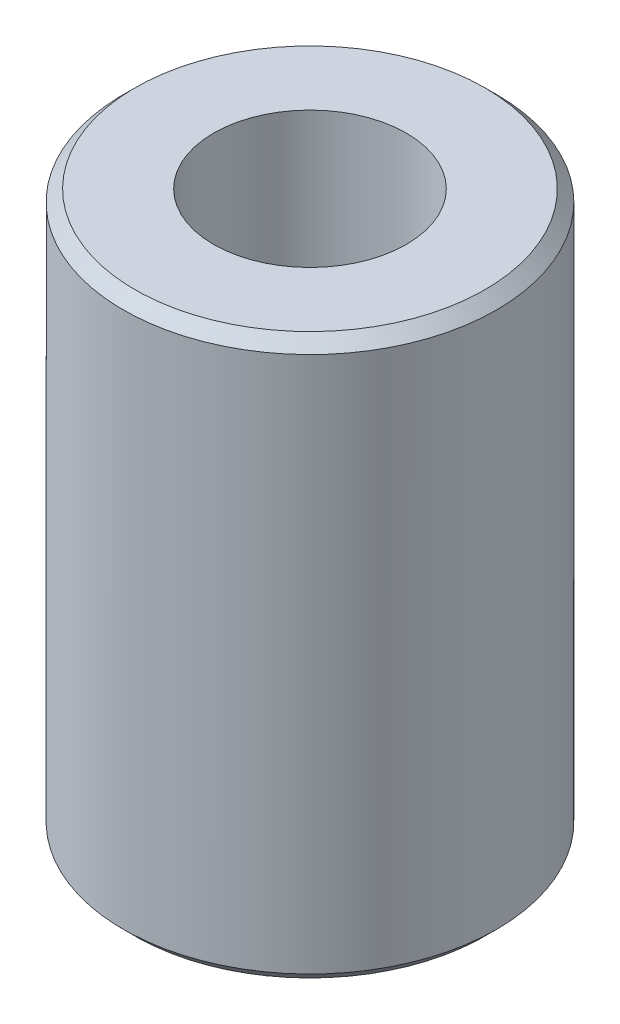
ISO-10303-21;
HEADER;
FILE_DESCRIPTION(('STEP AP214'),'2;1');
FILE_NAME('part.step','',(''),(''),'','','');
FILE_SCHEMA(('AUTOMOTIVE_DESIGN { 1 0 10303 214 1 1 1 1 }'));
ENDSEC;
DATA;
#1=APPLICATION_CONTEXT('core data for automotive mechanical design processes');
#2=APPLICATION_PROTOCOL_DEFINITION('international standard','automotive_design',2000,#1);
#3=PRODUCT_CONTEXT('',#1,'mechanical');
#4=PRODUCT('Part','Part','',(#3));
#5=PRODUCT_RELATED_PRODUCT_CATEGORY('part','',(#4));
#6=PRODUCT_DEFINITION_FORMATION('','',#4);
#7=PRODUCT_DEFINITION_CONTEXT('part definition',#1,'design');
#8=PRODUCT_DEFINITION('design','',#6,#7);
#9=PRODUCT_DEFINITION_SHAPE('','',#8);
#10=(LENGTH_UNIT() NAMED_UNIT(*) SI_UNIT(.MILLI.,.METRE.));
#11=(NAMED_UNIT(*) PLANE_ANGLE_UNIT() SI_UNIT($,.RADIAN.));
#12=(NAMED_UNIT(*) SI_UNIT($,.STERADIAN.) SOLID_ANGLE_UNIT());
#13=UNCERTAINTY_MEASURE_WITH_UNIT(LENGTH_MEASURE(1.E-05),#10,'distance_accuracy_value','');
#14=(GEOMETRIC_REPRESENTATION_CONTEXT(3) GLOBAL_UNCERTAINTY_ASSIGNED_CONTEXT((#13)) GLOBAL_UNIT_ASSIGNED_CONTEXT((#10,
#11,#12)) REPRESENTATION_CONTEXT('',''));
#15=CARTESIAN_POINT('',(0.,0.,0.));
#16=DIRECTION('',(0.,0.,1.));
#17=DIRECTION('',(1.,0.,0.));
#18=AXIS2_PLACEMENT_3D('',#15,#16,#17);
#19=CARTESIAN_POINT('',(0.,5.00000000118916,0.));
#20=DIRECTION('',(0.,1.,0.));
#21=DIRECTION('',(0.,0.,1.));
#22=AXIS2_PLACEMENT_3D('',#19,#20,#21);
#23=CONICAL_SURFACE('',#22,2.06699999921511,1.02974425747389);
#24=CARTESIAN_POINT('',(0.,3.75802109874712,0.));
#25=VERTEX_POINT('',#24);
#26=VERTEX_LOOP('',#25);
#27=FACE_BOUND('',#26,.T.);
#28=CARTESIAN_POINT('',(0.,5.,0.));
#29=DIRECTION('',(0.,1.,0.));
#30=DIRECTION('',(-1.,0.,0.));
#31=AXIS2_PLACEMENT_3D('',#28,#29,#30);
#32=CIRCLE('',#31,2.067);
#33=CARTESIAN_POINT('',(-2.067,5.,0.));
#34=VERTEX_POINT('',#33);
#35=EDGE_CURVE('E33',#34,#34,#32,.T.);
#36=ORIENTED_EDGE('',*,*,#35,.T.);
#37=EDGE_LOOP('',(#36));
#38=FACE_BOUND('',#37,.T.);
#39=ADVANCED_FACE('F17',(#27,#38),#23,.F.);
#40=CARTESIAN_POINT('',(0.,8.5,0.));
#41=DIRECTION('',(0.,1.,0.));
#42=DIRECTION('',(-1.,0.,0.));
#43=AXIS2_PLACEMENT_3D('',#40,#41,#42);
#44=CYLINDRICAL_SURFACE('',#43,2.067);
#45=ORIENTED_EDGE('',*,*,#35,.F.);
#46=EDGE_LOOP('',(#45));
#47=FACE_BOUND('',#46,.T.);
#48=CARTESIAN_POINT('',(0.,12.,0.));
#49=DIRECTION('',(0.,1.,0.));
#50=DIRECTION('',(-1.,0.,0.));
#51=AXIS2_PLACEMENT_3D('',#48,#49,#50);
#52=CIRCLE('',#51,2.067);
#53=CARTESIAN_POINT('',(-2.067,12.,0.));
#54=VERTEX_POINT('',#53);
#55=EDGE_CURVE('E20',#54,#54,#52,.F.);
#56=ORIENTED_EDGE('',*,*,#55,.F.);
#57=EDGE_LOOP('',(#56));
#58=FACE_BOUND('',#57,.T.);
#59=ADVANCED_FACE('F30',(#47,#58),#44,.F.);
#60=CARTESIAN_POINT('',(2.,0.,0.));
#61=DIRECTION('',(0.,-1.,0.));
#62=DIRECTION('',(0.,0.,-1.));
#63=AXIS2_PLACEMENT_3D('',#60,#61,#62);
#64=PLANE('',#63);
#65=CARTESIAN_POINT('',(0.,-1.13686946141833E-10,0.));
#66=DIRECTION('',(0.,1.,0.));
#67=DIRECTION('',(-1.,0.,0.));
#68=AXIS2_PLACEMENT_3D('',#65,#66,#67);
#69=CIRCLE('',#68,3.75000000008185);
#70=CARTESIAN_POINT('',(-3.75000000008185,-1.13686793675903E-10,0.));
#71=VERTEX_POINT('',#70);
#72=EDGE_CURVE('E37',#71,#71,#69,.T.);
#73=ORIENTED_EDGE('',*,*,#72,.F.);
#74=EDGE_LOOP('',(#73));
#75=FACE_BOUND('',#74,.T.);
#76=ADVANCED_FACE('F52',(#75),#64,.T.);
#77=CARTESIAN_POINT('',(2.,12.,0.));
#78=DIRECTION('',(0.,1.,0.));
#79=DIRECTION('',(0.,0.,1.));
#80=AXIS2_PLACEMENT_3D('',#77,#78,#79);
#81=PLANE('',#80);
#82=ORIENTED_EDGE('',*,*,#55,.T.);
#83=EDGE_LOOP('',(#82));
#84=FACE_BOUND('',#83,.T.);
#85=CARTESIAN_POINT('',(0.,12.0000000000573,0.));
#86=DIRECTION('',(0.,-1.,0.));
#87=DIRECTION('',(0.,0.,-1.));
#88=AXIS2_PLACEMENT_3D('',#85,#86,#87);
#89=CIRCLE('',#88,3.7500000001387);
#90=CARTESIAN_POINT('',(0.,12.0000000000573,-3.7500000001387));
#91=VERTEX_POINT('',#90);
#92=EDGE_CURVE('E44',#91,#91,#89,.T.);
#93=ORIENTED_EDGE('',*,*,#92,.F.);
#94=EDGE_LOOP('',(#93));
#95=FACE_BOUND('',#94,.T.);
#96=ADVANCED_FACE('F54',(#84,#95),#81,.T.);
#97=CARTESIAN_POINT('',(0.,0.250000000107775,0.));
#98=DIRECTION('',(0.,1.,0.));
#99=DIRECTION('',(-1.,0.,0.));
#100=AXIS2_PLACEMENT_3D('',#97,#98,#99);
#101=CONICAL_SURFACE('',#100,3.99999999984857,0.785398162487954);
#102=ORIENTED_EDGE('',*,*,#72,.T.);
#103=EDGE_LOOP('',(#102));
#104=FACE_BOUND('',#103,.T.);
#105=CARTESIAN_POINT('',(0.,0.249999999999992,0.));
#106=DIRECTION('',(0.,-1.,0.));
#107=DIRECTION('',(1.,0.,0.));
#108=AXIS2_PLACEMENT_3D('',#105,#106,#107);
#109=CIRCLE('',#108,4.);
#110=CARTESIAN_POINT('',(4.,0.249999999999992,0.));
#111=VERTEX_POINT('',#110);
#112=EDGE_CURVE('E24',#111,#111,#109,.F.);
#113=ORIENTED_EDGE('',*,*,#112,.F.);
#114=EDGE_LOOP('',(#113));
#115=FACE_BOUND('',#114,.T.);
#116=ADVANCED_FACE('F49',(#104,#115),#101,.T.);
#117=CARTESIAN_POINT('',(0.,11.7499999999495,0.));
#118=DIRECTION('',(0.,-1.,0.));
#119=DIRECTION('',(0.,0.,-1.));
#120=AXIS2_PLACEMENT_3D('',#117,#118,#119);
#121=CONICAL_SURFACE('',#120,3.99999999973488,0.785398162374266);
#122=CARTESIAN_POINT('',(0.,11.75,0.));
#123=DIRECTION('',(0.,-1.,0.));
#124=DIRECTION('',(1.,0.,0.));
#125=AXIS2_PLACEMENT_3D('',#122,#123,#124);
#126=CIRCLE('',#125,4.);
#127=CARTESIAN_POINT('',(4.,11.75,0.));
#128=VERTEX_POINT('',#127);
#129=EDGE_CURVE('E11',#128,#128,#126,.T.);
#130=ORIENTED_EDGE('',*,*,#129,.F.);
#131=EDGE_LOOP('',(#130));
#132=FACE_BOUND('',#131,.T.);
#133=ORIENTED_EDGE('',*,*,#92,.T.);
#134=EDGE_LOOP('',(#133));
#135=FACE_BOUND('',#134,.T.);
#136=ADVANCED_FACE('F65',(#132,#135),#121,.T.);
#137=CARTESIAN_POINT('',(0.,6.,0.));
#138=DIRECTION('',(0.,-1.,0.));
#139=DIRECTION('',(1.,0.,0.));
#140=AXIS2_PLACEMENT_3D('',#137,#138,#139);
#141=CYLINDRICAL_SURFACE('',#140,4.);
#142=ORIENTED_EDGE('',*,*,#129,.T.);
#143=EDGE_LOOP('',(#142));
#144=FACE_BOUND('',#143,.T.);
#145=ORIENTED_EDGE('',*,*,#112,.T.);
#146=EDGE_LOOP('',(#145));
#147=FACE_BOUND('',#146,.T.);
#148=ADVANCED_FACE('F63',(#144,#147),#141,.T.);
#149=CLOSED_SHELL('',(#39,#59,#76,#96,#116,#136,#148));
#150=MANIFOLD_SOLID_BREP('B1',#149);
#151=ADVANCED_BREP_SHAPE_REPRESENTATION('',(#18,#150),#14);
#152=SHAPE_DEFINITION_REPRESENTATION(#9,#151);
ENDSEC;
END-ISO-10303-21;
